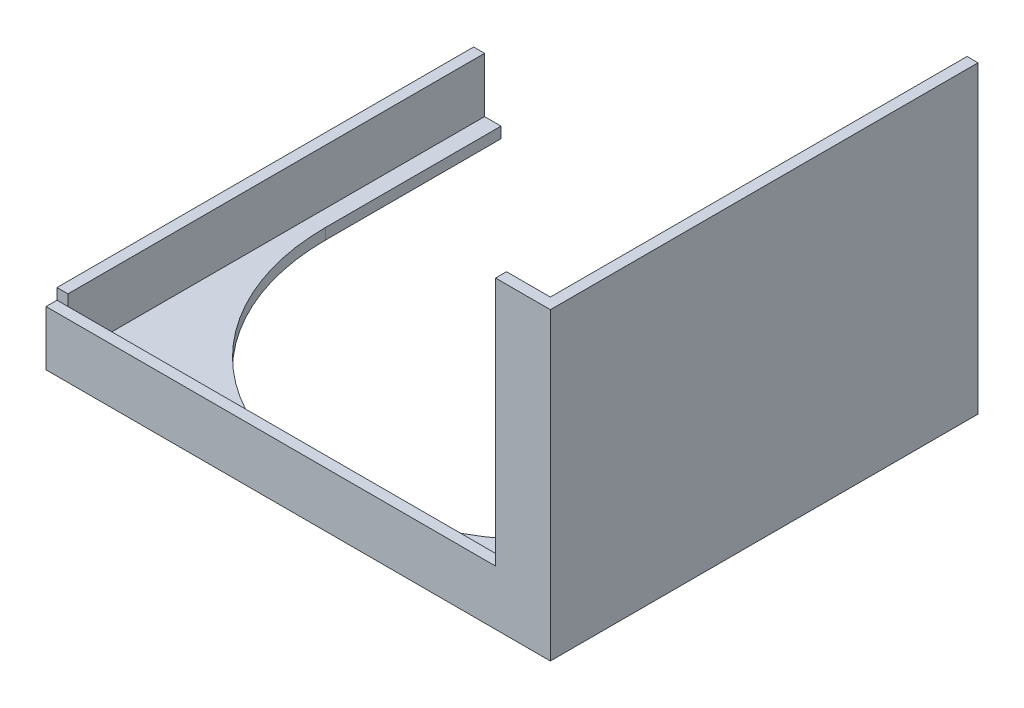
ISO-10303-21;
HEADER;
FILE_DESCRIPTION(('STEP AP214'),'2;1');
FILE_NAME('part.step','',(''),(''),'','','');
FILE_SCHEMA(('AUTOMOTIVE_DESIGN { 1 0 10303 214 1 1 1 1 }'));
ENDSEC;
DATA;
#1=APPLICATION_CONTEXT('core data for automotive mechanical design processes');
#2=APPLICATION_PROTOCOL_DEFINITION('international standard','automotive_design',2000,#1);
#3=PRODUCT_CONTEXT('',#1,'mechanical');
#4=PRODUCT('Part','Part','',(#3));
#5=PRODUCT_RELATED_PRODUCT_CATEGORY('part','',(#4));
#6=PRODUCT_DEFINITION_FORMATION('','',#4);
#7=PRODUCT_DEFINITION_CONTEXT('part definition',#1,'design');
#8=PRODUCT_DEFINITION('design','',#6,#7);
#9=PRODUCT_DEFINITION_SHAPE('','',#8);
#10=(LENGTH_UNIT() NAMED_UNIT(*) SI_UNIT(.MILLI.,.METRE.));
#11=(NAMED_UNIT(*) PLANE_ANGLE_UNIT() SI_UNIT($,.RADIAN.));
#12=(NAMED_UNIT(*) SI_UNIT($,.STERADIAN.) SOLID_ANGLE_UNIT());
#13=UNCERTAINTY_MEASURE_WITH_UNIT(LENGTH_MEASURE(1.E-05),#10,'distance_accuracy_value','');
#14=(GEOMETRIC_REPRESENTATION_CONTEXT(3) GLOBAL_UNCERTAINTY_ASSIGNED_CONTEXT((#13)) GLOBAL_UNIT_ASSIGNED_CONTEXT((#10,
#11,#12)) REPRESENTATION_CONTEXT('',''));
#15=CARTESIAN_POINT('',(0.,0.,0.));
#16=DIRECTION('',(0.,0.,1.));
#17=DIRECTION('',(1.,0.,0.));
#18=AXIS2_PLACEMENT_3D('',#15,#16,#17);
#19=CARTESIAN_POINT('',(-1.99999999999999,2.00000000000001,76.));
#20=DIRECTION('',(0.,-1.,0.));
#21=DIRECTION('',(1.,0.,0.));
#22=AXIS2_PLACEMENT_3D('',#19,#20,#21);
#23=PLANE('',#22);
#24=DIRECTION('',(0.,0.,-1.));
#25=VECTOR('',#24,1.);
#26=CARTESIAN_POINT('',(-90.,2.00000000000001,76.));
#27=LINE('',#26,#25);
#28=CARTESIAN_POINT('',(-90.,2.00000000000001,76.));
#29=VERTEX_POINT('',#28);
#30=CARTESIAN_POINT('',(-90.,2.00000000000001,0.));
#31=VERTEX_POINT('',#30);
#32=EDGE_CURVE('E281',#29,#31,#27,.T.);
#33=ORIENTED_EDGE('',*,*,#32,.F.);
#34=DIRECTION('',(-1.,0.,0.));
#35=VECTOR('',#34,1.);
#36=CARTESIAN_POINT('',(-1.99999999999999,2.00000000000001,76.));
#37=LINE('',#36,#35);
#38=CARTESIAN_POINT('',(-1.99999999999999,2.00000000000001,76.));
#39=VERTEX_POINT('',#38);
#40=EDGE_CURVE('E94',#39,#29,#37,.T.);
#41=ORIENTED_EDGE('',*,*,#40,.F.);
#42=DIRECTION('',(0.,0.,-1.));
#43=VECTOR('',#42,1.);
#44=CARTESIAN_POINT('',(-1.99999999999999,2.00000000000001,76.));
#45=LINE('',#44,#43);
#46=CARTESIAN_POINT('',(-1.99999999999999,2.00000000000001,0.));
#47=VERTEX_POINT('',#46);
#48=EDGE_CURVE('E59',#39,#47,#45,.T.);
#49=ORIENTED_EDGE('',*,*,#48,.T.);
#50=DIRECTION('',(-1.,0.,0.));
#51=VECTOR('',#50,1.);
#52=CARTESIAN_POINT('',(-1.99999999999999,2.00000000000001,0.));
#53=LINE('',#52,#51);
#54=CARTESIAN_POINT('',(-5.,2.00000000000001,0.));
#55=VERTEX_POINT('',#54);
#56=EDGE_CURVE('E92',#47,#55,#53,.T.);
#57=ORIENTED_EDGE('',*,*,#56,.T.);
#58=DIRECTION('',(0.,0.,1.));
#59=VECTOR('',#58,1.);
#60=CARTESIAN_POINT('',(-5.,2.00000000000001,76.));
#61=LINE('',#60,#59);
#62=CARTESIAN_POINT('',(-5.,2.00000000000001,32.));
#63=VERTEX_POINT('',#62);
#64=EDGE_CURVE('E50',#55,#63,#61,.T.);
#65=ORIENTED_EDGE('',*,*,#64,.T.);
#66=CARTESIAN_POINT('',(-46.,2.00000000000001,32.));
#67=DIRECTION('',(0.,-1.,0.));
#68=DIRECTION('',(1.,0.,0.));
#69=AXIS2_PLACEMENT_3D('',#66,#67,#68);
#70=CIRCLE('',#69,41.);
#71=CARTESIAN_POINT('',(-87.,2.00000000000001,32.));
#72=VERTEX_POINT('',#71);
#73=EDGE_CURVE('E11',#63,#72,#70,.T.);
#74=ORIENTED_EDGE('',*,*,#73,.T.);
#75=DIRECTION('',(0.,0.,-1.));
#76=VECTOR('',#75,1.);
#77=CARTESIAN_POINT('',(-87.,2.,76.));
#78=LINE('',#77,#76);
#79=CARTESIAN_POINT('',(-87.,2.00000000000001,0.));
#80=VERTEX_POINT('',#79);
#81=EDGE_CURVE('E187',#72,#80,#78,.T.);
#82=ORIENTED_EDGE('',*,*,#81,.T.);
#83=EDGE_CURVE('E86',#80,#31,#53,.T.);
#84=ORIENTED_EDGE('',*,*,#83,.T.);
#85=EDGE_LOOP('',(#33,#41,#49,#57,#65,#74,#82,#84));
#86=FACE_BOUND('',#85,.T.);
#87=ADVANCED_FACE('F35',(#86),#23,.F.);
#88=CARTESIAN_POINT('',(0.,0.,76.));
#89=DIRECTION('',(0.,0.,1.));
#90=DIRECTION('',(1.,0.,0.));
#91=AXIS2_PLACEMENT_3D('',#88,#89,#90);
#92=PLANE('',#91);
#93=DIRECTION('',(0.,-1.,0.));
#94=VECTOR('',#93,1.);
#95=CARTESIAN_POINT('',(-90.,12.,76.));
#96=LINE('',#95,#94);
#97=CARTESIAN_POINT('',(-90.,9.99999999999999,76.));
#98=VERTEX_POINT('',#97);
#99=EDGE_CURVE('E205',#98,#29,#96,.T.);
#100=ORIENTED_EDGE('',*,*,#99,.F.);
#101=DIRECTION('',(-1.,0.,0.));
#102=VECTOR('',#101,1.);
#103=CARTESIAN_POINT('',(-9.99999999999999,10.,76.));
#104=LINE('',#103,#102);
#105=CARTESIAN_POINT('',(-9.99999999999999,10.,76.));
#106=VERTEX_POINT('',#105);
#107=EDGE_CURVE('E191',#106,#98,#104,.T.);
#108=ORIENTED_EDGE('',*,*,#107,.F.);
#109=DIRECTION('',(0.,-1.,0.));
#110=VECTOR('',#109,1.);
#111=CARTESIAN_POINT('',(-10.,55.5,76.));
#112=LINE('',#111,#110);
#113=CARTESIAN_POINT('',(-10.,55.5,76.));
#114=VERTEX_POINT('',#113);
#115=EDGE_CURVE('E186',#114,#106,#112,.T.);
#116=ORIENTED_EDGE('',*,*,#115,.F.);
#117=DIRECTION('',(-1.,0.,0.));
#118=VECTOR('',#117,1.);
#119=CARTESIAN_POINT('',(0.,55.5,76.));
#120=LINE('',#119,#118);
#121=CARTESIAN_POINT('',(-2.,55.5,76.));
#122=VERTEX_POINT('',#121);
#123=EDGE_CURVE('E184',#122,#114,#120,.T.);
#124=ORIENTED_EDGE('',*,*,#123,.F.);
#125=DIRECTION('',(0.,-1.,0.));
#126=VECTOR('',#125,1.);
#127=CARTESIAN_POINT('',(-2.,55.5,76.));
#128=LINE('',#127,#126);
#129=EDGE_CURVE('E100',#122,#39,#128,.T.);
#130=ORIENTED_EDGE('',*,*,#129,.T.);
#131=ORIENTED_EDGE('',*,*,#40,.T.);
#132=EDGE_LOOP('',(#100,#108,#116,#124,#130,#131));
#133=FACE_BOUND('',#132,.T.);
#134=ADVANCED_FACE('F201',(#133),#92,.F.);
#135=CARTESIAN_POINT('',(0.,0.,0.));
#136=DIRECTION('',(0.,0.,1.));
#137=DIRECTION('',(1.,0.,0.));
#138=AXIS2_PLACEMENT_3D('',#135,#136,#137);
#139=PLANE('',#138);
#140=ORIENTED_EDGE('',*,*,#83,.F.);
#141=DIRECTION('',(0.,-1.,0.));
#142=VECTOR('',#141,1.);
#143=CARTESIAN_POINT('',(-87.,0.,0.));
#144=LINE('',#143,#142);
#145=CARTESIAN_POINT('',(-87.,0.,0.));
#146=VERTEX_POINT('',#145);
#147=EDGE_CURVE('E43',#80,#146,#144,.T.);
#148=ORIENTED_EDGE('',*,*,#147,.T.);
#149=DIRECTION('',(1.,0.,0.));
#150=VECTOR('',#149,1.);
#151=CARTESIAN_POINT('',(-92.,0.,0.));
#152=LINE('',#151,#150);
#153=CARTESIAN_POINT('',(-92.,0.,0.));
#154=VERTEX_POINT('',#153);
#155=EDGE_CURVE('E124',#154,#146,#152,.T.);
#156=ORIENTED_EDGE('',*,*,#155,.F.);
#157=DIRECTION('',(0.,-1.,0.));
#158=VECTOR('',#157,1.);
#159=CARTESIAN_POINT('',(-92.,2.,0.));
#160=LINE('',#159,#158);
#161=CARTESIAN_POINT('',(-92.,12.,0.));
#162=VERTEX_POINT('',#161);
#163=EDGE_CURVE('E146',#162,#154,#160,.T.);
#164=ORIENTED_EDGE('',*,*,#163,.F.);
#165=DIRECTION('',(-1.,0.,0.));
#166=VECTOR('',#165,1.);
#167=CARTESIAN_POINT('',(-92.,12.,0.));
#168=LINE('',#167,#166);
#169=CARTESIAN_POINT('',(-90.,12.,0.));
#170=VERTEX_POINT('',#169);
#171=EDGE_CURVE('E268',#170,#162,#168,.T.);
#172=ORIENTED_EDGE('',*,*,#171,.F.);
#173=DIRECTION('',(0.,-1.,0.));
#174=VECTOR('',#173,1.);
#175=CARTESIAN_POINT('',(-90.,12.,0.));
#176=LINE('',#175,#174);
#177=EDGE_CURVE('E275',#170,#31,#176,.T.);
#178=ORIENTED_EDGE('',*,*,#177,.T.);
#179=EDGE_LOOP('',(#140,#148,#156,#164,#172,#178));
#180=FACE_BOUND('',#179,.T.);
#181=ADVANCED_FACE('F122',(#180),#139,.F.);
#182=CARTESIAN_POINT('',(-92.,2.,76.));
#183=DIRECTION('',(1.,0.,0.));
#184=DIRECTION('',(0.,0.,-1.));
#185=AXIS2_PLACEMENT_3D('',#182,#183,#184);
#186=PLANE('',#185);
#187=DIRECTION('',(0.,0.,1.));
#188=VECTOR('',#187,1.);
#189=CARTESIAN_POINT('',(-92.,12.,76.));
#190=LINE('',#189,#188);
#191=CARTESIAN_POINT('',(-92.,12.,76.));
#192=VERTEX_POINT('',#191);
#193=EDGE_CURVE('E264',#162,#192,#190,.T.);
#194=ORIENTED_EDGE('',*,*,#193,.F.);
#195=ORIENTED_EDGE('',*,*,#163,.T.);
#196=DIRECTION('',(0.,0.,-1.));
#197=VECTOR('',#196,1.);
#198=CARTESIAN_POINT('',(-92.,0.,76.));
#199=LINE('',#198,#197);
#200=CARTESIAN_POINT('',(-92.,0.,78.));
#201=VERTEX_POINT('',#200);
#202=EDGE_CURVE('E113',#201,#154,#199,.T.);
#203=ORIENTED_EDGE('',*,*,#202,.F.);
#204=DIRECTION('',(0.,-1.,0.));
#205=VECTOR('',#204,1.);
#206=CARTESIAN_POINT('',(-92.,9.99999999999999,78.));
#207=LINE('',#206,#205);
#208=CARTESIAN_POINT('',(-92.,9.99999999999999,78.));
#209=VERTEX_POINT('',#208);
#210=EDGE_CURVE('E174',#209,#201,#207,.T.);
#211=ORIENTED_EDGE('',*,*,#210,.F.);
#212=DIRECTION('',(0.,0.,-1.));
#213=VECTOR('',#212,1.);
#214=CARTESIAN_POINT('',(-92.,9.99999999999999,78.));
#215=LINE('',#214,#213);
#216=CARTESIAN_POINT('',(-92.,9.99999999999999,76.));
#217=VERTEX_POINT('',#216);
#218=EDGE_CURVE('E175',#209,#217,#215,.T.);
#219=ORIENTED_EDGE('',*,*,#218,.T.);
#220=DIRECTION('',(0.,-1.,0.));
#221=VECTOR('',#220,1.);
#222=CARTESIAN_POINT('',(-92.,12.,76.));
#223=LINE('',#222,#221);
#224=EDGE_CURVE('E248',#192,#217,#223,.T.);
#225=ORIENTED_EDGE('',*,*,#224,.F.);
#226=EDGE_LOOP('',(#194,#195,#203,#211,#219,#225));
#227=FACE_BOUND('',#226,.T.);
#228=ADVANCED_FACE('F37',(#227),#186,.F.);
#229=CARTESIAN_POINT('',(-92.,0.,76.));
#230=DIRECTION('',(0.,1.,0.));
#231=DIRECTION('',(0.,0.,1.));
#232=AXIS2_PLACEMENT_3D('',#229,#230,#231);
#233=PLANE('',#232);
#234=ORIENTED_EDGE('',*,*,#155,.T.);
#235=DIRECTION('',(0.,0.,-1.));
#236=VECTOR('',#235,1.);
#237=CARTESIAN_POINT('',(-87.,0.,0.));
#238=LINE('',#237,#236);
#239=CARTESIAN_POINT('',(-87.,0.,32.));
#240=VERTEX_POINT('',#239);
#241=EDGE_CURVE('E138',#240,#146,#238,.T.);
#242=ORIENTED_EDGE('',*,*,#241,.F.);
#243=CARTESIAN_POINT('',(-46.,0.,32.));
#244=DIRECTION('',(0.,-1.,0.));
#245=DIRECTION('',(0.,0.,1.));
#246=AXIS2_PLACEMENT_3D('',#243,#244,#245);
#247=CIRCLE('',#246,41.);
#248=CARTESIAN_POINT('',(-5.,0.,32.));
#249=VERTEX_POINT('',#248);
#250=EDGE_CURVE('E286',#249,#240,#247,.T.);
#251=ORIENTED_EDGE('',*,*,#250,.F.);
#252=DIRECTION('',(0.,0.,1.));
#253=VECTOR('',#252,1.);
#254=CARTESIAN_POINT('',(-5.,0.,0.));
#255=LINE('',#254,#253);
#256=CARTESIAN_POINT('',(-5.,0.,0.));
#257=VERTEX_POINT('',#256);
#258=EDGE_CURVE('E257',#257,#249,#255,.T.);
#259=ORIENTED_EDGE('',*,*,#258,.F.);
#260=CARTESIAN_POINT('',(0.,0.,0.));
#261=VERTEX_POINT('',#260);
#262=EDGE_CURVE('E143',#257,#261,#152,.T.);
#263=ORIENTED_EDGE('',*,*,#262,.T.);
#264=DIRECTION('',(0.,0.,-1.));
#265=VECTOR('',#264,1.);
#266=CARTESIAN_POINT('',(0.,0.,76.));
#267=LINE('',#266,#265);
#268=CARTESIAN_POINT('',(0.,0.,78.));
#269=VERTEX_POINT('',#268);
#270=EDGE_CURVE('E110',#269,#261,#267,.T.);
#271=ORIENTED_EDGE('',*,*,#270,.F.);
#272=DIRECTION('',(1.,0.,0.));
#273=VECTOR('',#272,1.);
#274=CARTESIAN_POINT('',(-92.,0.,78.));
#275=LINE('',#274,#273);
#276=EDGE_CURVE('E165',#201,#269,#275,.T.);
#277=ORIENTED_EDGE('',*,*,#276,.F.);
#278=ORIENTED_EDGE('',*,*,#202,.T.);
#279=EDGE_LOOP('',(#234,#242,#251,#259,#263,#271,#277,#278));
#280=FACE_BOUND('',#279,.T.);
#281=ADVANCED_FACE('F136',(#280),#233,.F.);
#282=CARTESIAN_POINT('',(0.,0.,76.));
#283=DIRECTION('',(-1.,0.,0.));
#284=DIRECTION('',(0.,0.,1.));
#285=AXIS2_PLACEMENT_3D('',#282,#283,#284);
#286=PLANE('',#285);
#287=DIRECTION('',(0.,1.,0.));
#288=VECTOR('',#287,1.);
#289=CARTESIAN_POINT('',(0.,0.,0.));
#290=LINE('',#289,#288);
#291=CARTESIAN_POINT('',(0.,55.5,0.));
#292=VERTEX_POINT('',#291);
#293=EDGE_CURVE('E142',#261,#292,#290,.T.);
#294=ORIENTED_EDGE('',*,*,#293,.T.);
#295=DIRECTION('',(0.,0.,-1.));
#296=VECTOR('',#295,1.);
#297=CARTESIAN_POINT('',(0.,55.5,76.));
#298=LINE('',#297,#296);
#299=CARTESIAN_POINT('',(0.,55.5,78.));
#300=VERTEX_POINT('',#299);
#301=EDGE_CURVE('E107',#300,#292,#298,.T.);
#302=ORIENTED_EDGE('',*,*,#301,.F.);
#303=DIRECTION('',(0.,1.,0.));
#304=VECTOR('',#303,1.);
#305=CARTESIAN_POINT('',(0.,0.,78.));
#306=LINE('',#305,#304);
#307=EDGE_CURVE('E162',#269,#300,#306,.T.);
#308=ORIENTED_EDGE('',*,*,#307,.F.);
#309=ORIENTED_EDGE('',*,*,#270,.T.);
#310=EDGE_LOOP('',(#294,#302,#308,#309));
#311=FACE_BOUND('',#310,.T.);
#312=ADVANCED_FACE('F157',(#311),#286,.F.);
#313=CARTESIAN_POINT('',(0.,55.5,76.));
#314=DIRECTION('',(0.,-1.,0.));
#315=DIRECTION('',(0.,0.,-1.));
#316=AXIS2_PLACEMENT_3D('',#313,#314,#315);
#317=PLANE('',#316);
#318=DIRECTION('',(-1.,0.,0.));
#319=VECTOR('',#318,1.);
#320=CARTESIAN_POINT('',(0.,55.5,0.));
#321=LINE('',#320,#319);
#322=CARTESIAN_POINT('',(-2.,55.5,0.));
#323=VERTEX_POINT('',#322);
#324=EDGE_CURVE('E87',#292,#323,#321,.T.);
#325=ORIENTED_EDGE('',*,*,#324,.T.);
#326=DIRECTION('',(0.,0.,-1.));
#327=VECTOR('',#326,1.);
#328=CARTESIAN_POINT('',(-2.,55.5,76.));
#329=LINE('',#328,#327);
#330=EDGE_CURVE('E82',#122,#323,#329,.T.);
#331=ORIENTED_EDGE('',*,*,#330,.F.);
#332=ORIENTED_EDGE('',*,*,#123,.T.);
#333=DIRECTION('',(0.,0.,-1.));
#334=VECTOR('',#333,1.);
#335=CARTESIAN_POINT('',(-10.,55.5,78.));
#336=LINE('',#335,#334);
#337=CARTESIAN_POINT('',(-10.,55.5,78.));
#338=VERTEX_POINT('',#337);
#339=EDGE_CURVE('E196',#338,#114,#336,.T.);
#340=ORIENTED_EDGE('',*,*,#339,.F.);
#341=DIRECTION('',(-1.,0.,0.));
#342=VECTOR('',#341,1.);
#343=CARTESIAN_POINT('',(0.,55.5,78.));
#344=LINE('',#343,#342);
#345=EDGE_CURVE('E297',#300,#338,#344,.T.);
#346=ORIENTED_EDGE('',*,*,#345,.F.);
#347=ORIENTED_EDGE('',*,*,#301,.T.);
#348=EDGE_LOOP('',(#325,#331,#332,#340,#346,#347));
#349=FACE_BOUND('',#348,.T.);
#350=ADVANCED_FACE('F150',(#349),#317,.F.);
#351=CARTESIAN_POINT('',(-2.,55.5,76.));
#352=DIRECTION('',(1.,0.,0.));
#353=DIRECTION('',(0.,1.,0.));
#354=AXIS2_PLACEMENT_3D('',#351,#352,#353);
#355=PLANE('',#354);
#356=DIRECTION('',(0.,-1.,0.));
#357=VECTOR('',#356,1.);
#358=CARTESIAN_POINT('',(-2.,55.5,0.));
#359=LINE('',#358,#357);
#360=EDGE_CURVE('E80',#323,#47,#359,.T.);
#361=ORIENTED_EDGE('',*,*,#360,.T.);
#362=ORIENTED_EDGE('',*,*,#48,.F.);
#363=ORIENTED_EDGE('',*,*,#129,.F.);
#364=ORIENTED_EDGE('',*,*,#330,.T.);
#365=EDGE_LOOP('',(#361,#362,#363,#364));
#366=FACE_BOUND('',#365,.T.);
#367=ADVANCED_FACE('F81',(#366),#355,.F.);
#368=ORIENTED_EDGE('',*,*,#262,.F.);
#369=DIRECTION('',(0.,1.,0.));
#370=VECTOR('',#369,1.);
#371=CARTESIAN_POINT('',(-5.,0.,0.));
#372=LINE('',#371,#370);
#373=EDGE_CURVE('E99',#257,#55,#372,.T.);
#374=ORIENTED_EDGE('',*,*,#373,.T.);
#375=ORIENTED_EDGE('',*,*,#56,.F.);
#376=ORIENTED_EDGE('',*,*,#360,.F.);
#377=ORIENTED_EDGE('',*,*,#324,.F.);
#378=ORIENTED_EDGE('',*,*,#293,.F.);
#379=EDGE_LOOP('',(#368,#374,#375,#376,#377,#378));
#380=FACE_BOUND('',#379,.T.);
#381=ADVANCED_FACE('F98',(#380),#139,.F.);
#382=CARTESIAN_POINT('',(-10.,55.5,78.));
#383=DIRECTION('',(1.,0.,0.));
#384=DIRECTION('',(0.,1.,0.));
#385=AXIS2_PLACEMENT_3D('',#382,#383,#384);
#386=PLANE('',#385);
#387=ORIENTED_EDGE('',*,*,#115,.T.);
#388=DIRECTION('',(0.,0.,-1.));
#389=VECTOR('',#388,1.);
#390=CARTESIAN_POINT('',(-9.99999999999999,10.,78.));
#391=LINE('',#390,#389);
#392=CARTESIAN_POINT('',(-9.99999999999999,10.,78.));
#393=VERTEX_POINT('',#392);
#394=EDGE_CURVE('E178',#393,#106,#391,.T.);
#395=ORIENTED_EDGE('',*,*,#394,.F.);
#396=DIRECTION('',(0.,-1.,0.));
#397=VECTOR('',#396,1.);
#398=CARTESIAN_POINT('',(-10.,55.5,78.));
#399=LINE('',#398,#397);
#400=EDGE_CURVE('E299',#338,#393,#399,.T.);
#401=ORIENTED_EDGE('',*,*,#400,.F.);
#402=ORIENTED_EDGE('',*,*,#339,.T.);
#403=EDGE_LOOP('',(#387,#395,#401,#402));
#404=FACE_BOUND('',#403,.T.);
#405=ADVANCED_FACE('F304',(#404),#386,.F.);
#406=CARTESIAN_POINT('',(-9.99999999999999,10.,78.));
#407=DIRECTION('',(0.,-1.,0.));
#408=DIRECTION('',(1.,0.,0.));
#409=AXIS2_PLACEMENT_3D('',#406,#407,#408);
#410=PLANE('',#409);
#411=ORIENTED_EDGE('',*,*,#107,.T.);
#412=EDGE_CURVE('E190',#98,#217,#104,.T.);
#413=ORIENTED_EDGE('',*,*,#412,.T.);
#414=ORIENTED_EDGE('',*,*,#218,.F.);
#415=DIRECTION('',(-1.,0.,0.));
#416=VECTOR('',#415,1.);
#417=CARTESIAN_POINT('',(-9.99999999999999,10.,78.));
#418=LINE('',#417,#416);
#419=EDGE_CURVE('E180',#393,#209,#418,.T.);
#420=ORIENTED_EDGE('',*,*,#419,.F.);
#421=ORIENTED_EDGE('',*,*,#394,.T.);
#422=EDGE_LOOP('',(#411,#413,#414,#420,#421));
#423=FACE_BOUND('',#422,.T.);
#424=ADVANCED_FACE('F262',(#423),#410,.F.);
#425=CARTESIAN_POINT('',(0.,0.,78.));
#426=DIRECTION('',(0.,0.,1.));
#427=DIRECTION('',(1.,0.,0.));
#428=AXIS2_PLACEMENT_3D('',#425,#426,#427);
#429=PLANE('',#428);
#430=ORIENTED_EDGE('',*,*,#307,.T.);
#431=ORIENTED_EDGE('',*,*,#345,.T.);
#432=ORIENTED_EDGE('',*,*,#400,.T.);
#433=ORIENTED_EDGE('',*,*,#419,.T.);
#434=ORIENTED_EDGE('',*,*,#210,.T.);
#435=ORIENTED_EDGE('',*,*,#276,.T.);
#436=EDGE_LOOP('',(#430,#431,#432,#433,#434,#435));
#437=FACE_BOUND('',#436,.T.);
#438=ADVANCED_FACE('F170',(#437),#429,.T.);
#439=CARTESIAN_POINT('',(-46.,10.,32.));
#440=DIRECTION('',(0.,-1.,0.));
#441=DIRECTION('',(0.,0.,-1.));
#442=AXIS2_PLACEMENT_3D('',#439,#440,#441);
#443=CYLINDRICAL_SURFACE('',#442,41.);
#444=DIRECTION('',(0.,-1.,0.));
#445=VECTOR('',#444,1.);
#446=CARTESIAN_POINT('',(-5.,10.,32.));
#447=LINE('',#446,#445);
#448=EDGE_CURVE('E290',#63,#249,#447,.T.);
#449=ORIENTED_EDGE('',*,*,#448,.T.);
#450=ORIENTED_EDGE('',*,*,#250,.T.);
#451=DIRECTION('',(0.,-1.,0.));
#452=VECTOR('',#451,1.);
#453=CARTESIAN_POINT('',(-87.,10.,32.));
#454=LINE('',#453,#452);
#455=EDGE_CURVE('E291',#72,#240,#454,.T.);
#456=ORIENTED_EDGE('',*,*,#455,.F.);
#457=ORIENTED_EDGE('',*,*,#73,.F.);
#458=EDGE_LOOP('',(#449,#450,#456,#457));
#459=FACE_BOUND('',#458,.T.);
#460=ADVANCED_FACE('F363',(#459),#443,.F.);
#461=CARTESIAN_POINT('',(-87.,10.,0.));
#462=DIRECTION('',(-1.,0.,0.));
#463=DIRECTION('',(0.,0.,1.));
#464=AXIS2_PLACEMENT_3D('',#461,#462,#463);
#465=PLANE('',#464);
#466=ORIENTED_EDGE('',*,*,#455,.T.);
#467=ORIENTED_EDGE('',*,*,#241,.T.);
#468=ORIENTED_EDGE('',*,*,#147,.F.);
#469=ORIENTED_EDGE('',*,*,#81,.F.);
#470=EDGE_LOOP('',(#466,#467,#468,#469));
#471=FACE_BOUND('',#470,.T.);
#472=ADVANCED_FACE('F353',(#471),#465,.F.);
#473=CARTESIAN_POINT('',(-5.,10.,0.));
#474=DIRECTION('',(1.,0.,0.));
#475=DIRECTION('',(0.,0.,-1.));
#476=AXIS2_PLACEMENT_3D('',#473,#474,#475);
#477=PLANE('',#476);
#478=ORIENTED_EDGE('',*,*,#373,.F.);
#479=ORIENTED_EDGE('',*,*,#258,.T.);
#480=ORIENTED_EDGE('',*,*,#448,.F.);
#481=ORIENTED_EDGE('',*,*,#64,.F.);
#482=EDGE_LOOP('',(#478,#479,#480,#481));
#483=FACE_BOUND('',#482,.T.);
#484=ADVANCED_FACE('F349',(#483),#477,.F.);
#485=CARTESIAN_POINT('',(-92.,12.,76.));
#486=DIRECTION('',(0.,0.,-1.));
#487=DIRECTION('',(-1.,0.,0.));
#488=AXIS2_PLACEMENT_3D('',#485,#486,#487);
#489=PLANE('',#488);
#490=ORIENTED_EDGE('',*,*,#224,.T.);
#491=ORIENTED_EDGE('',*,*,#412,.F.);
#492=CARTESIAN_POINT('',(-90.,12.,76.));
#493=VERTEX_POINT('',#492);
#494=EDGE_CURVE('E258',#493,#98,#96,.T.);
#495=ORIENTED_EDGE('',*,*,#494,.F.);
#496=DIRECTION('',(1.,0.,0.));
#497=VECTOR('',#496,1.);
#498=CARTESIAN_POINT('',(-92.,12.,76.));
#499=LINE('',#498,#497);
#500=EDGE_CURVE('E253',#192,#493,#499,.T.);
#501=ORIENTED_EDGE('',*,*,#500,.F.);
#502=EDGE_LOOP('',(#490,#491,#495,#501));
#503=FACE_BOUND('',#502,.T.);
#504=ADVANCED_FACE('F250',(#503),#489,.F.);
#505=CARTESIAN_POINT('',(-90.,12.,76.));
#506=DIRECTION('',(-1.,0.,0.));
#507=DIRECTION('',(0.,-1.,0.));
#508=AXIS2_PLACEMENT_3D('',#505,#506,#507);
#509=PLANE('',#508);
#510=ORIENTED_EDGE('',*,*,#32,.T.);
#511=ORIENTED_EDGE('',*,*,#177,.F.);
#512=DIRECTION('',(0.,0.,-1.));
#513=VECTOR('',#512,1.);
#514=CARTESIAN_POINT('',(-90.,12.,76.));
#515=LINE('',#514,#513);
#516=EDGE_CURVE('E273',#493,#170,#515,.T.);
#517=ORIENTED_EDGE('',*,*,#516,.F.);
#518=ORIENTED_EDGE('',*,*,#494,.T.);
#519=ORIENTED_EDGE('',*,*,#99,.T.);
#520=EDGE_LOOP('',(#510,#511,#517,#518,#519));
#521=FACE_BOUND('',#520,.T.);
#522=ADVANCED_FACE('F445',(#521),#509,.F.);
#523=CARTESIAN_POINT('',(0.,12.,0.));
#524=DIRECTION('',(0.,-1.,0.));
#525=DIRECTION('',(0.,0.,-1.));
#526=AXIS2_PLACEMENT_3D('',#523,#524,#525);
#527=PLANE('',#526);
#528=ORIENTED_EDGE('',*,*,#193,.T.);
#529=ORIENTED_EDGE('',*,*,#500,.T.);
#530=ORIENTED_EDGE('',*,*,#516,.T.);
#531=ORIENTED_EDGE('',*,*,#171,.T.);
#532=EDGE_LOOP('',(#528,#529,#530,#531));
#533=FACE_BOUND('',#532,.T.);
#534=ADVANCED_FACE('F271',(#533),#527,.F.);
#535=CLOSED_SHELL('',(#87,#134,#181,#228,#281,#312,#350,#367,#381,#405,#424,#438,#460,#472,#484,
#504,#522,#534));
#536=MANIFOLD_SOLID_BREP('B2',#535);
#537=ADVANCED_BREP_SHAPE_REPRESENTATION('',(#18,#536),#14);
#538=SHAPE_DEFINITION_REPRESENTATION(#9,#537);
ENDSEC;
END-ISO-10303-21;
